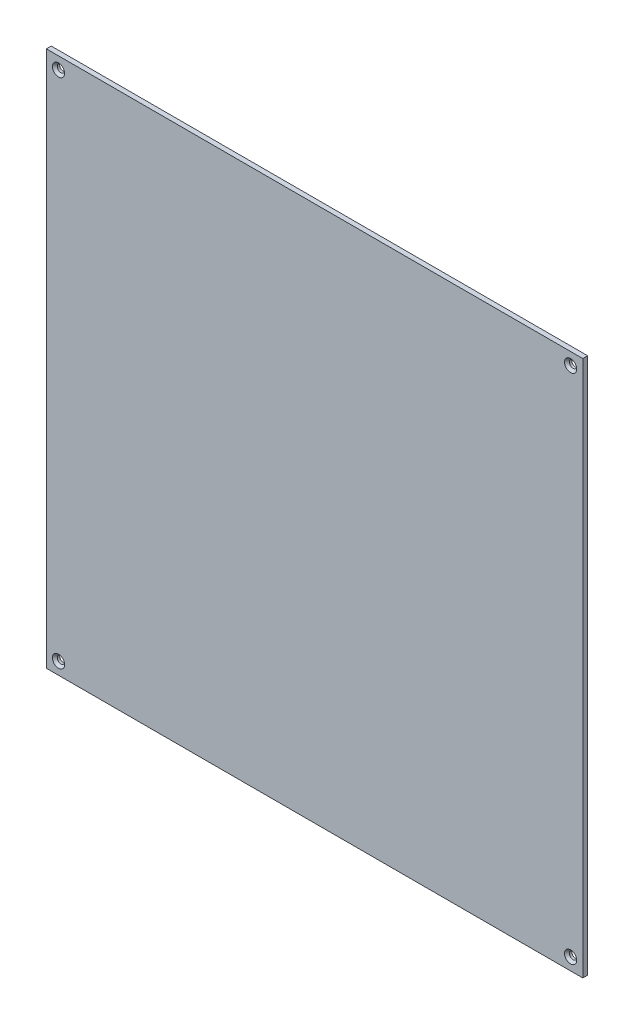
ISO-10303-21;
HEADER;
FILE_DESCRIPTION(('STEP AP214'),'2;1');
FILE_NAME('part.step','',(''),(''),'','','');
FILE_SCHEMA(('AUTOMOTIVE_DESIGN { 1 0 10303 214 1 1 1 1 }'));
ENDSEC;
DATA;
#1=APPLICATION_CONTEXT('core data for automotive mechanical design processes');
#2=APPLICATION_PROTOCOL_DEFINITION('international standard','automotive_design',2000,#1);
#3=PRODUCT_CONTEXT('',#1,'mechanical');
#4=PRODUCT('Part','Part','',(#3));
#5=PRODUCT_RELATED_PRODUCT_CATEGORY('part','',(#4));
#6=PRODUCT_DEFINITION_FORMATION('','',#4);
#7=PRODUCT_DEFINITION_CONTEXT('part definition',#1,'design');
#8=PRODUCT_DEFINITION('design','',#6,#7);
#9=PRODUCT_DEFINITION_SHAPE('','',#8);
#10=(LENGTH_UNIT() NAMED_UNIT(*) SI_UNIT(.MILLI.,.METRE.));
#11=(NAMED_UNIT(*) PLANE_ANGLE_UNIT() SI_UNIT($,.RADIAN.));
#12=(NAMED_UNIT(*) SI_UNIT($,.STERADIAN.) SOLID_ANGLE_UNIT());
#13=UNCERTAINTY_MEASURE_WITH_UNIT(LENGTH_MEASURE(1.E-05),#10,'distance_accuracy_value','');
#14=(GEOMETRIC_REPRESENTATION_CONTEXT(3) GLOBAL_UNCERTAINTY_ASSIGNED_CONTEXT((#13)) GLOBAL_UNIT_ASSIGNED_CONTEXT((#10,
#11,#12)) REPRESENTATION_CONTEXT('',''));
#15=CARTESIAN_POINT('',(0.,0.,0.));
#16=DIRECTION('',(0.,0.,1.));
#17=DIRECTION('',(1.,0.,0.));
#18=AXIS2_PLACEMENT_3D('',#15,#16,#17);
#19=CARTESIAN_POINT('',(0.,0.,2.));
#20=DIRECTION('',(0.,0.,1.));
#21=DIRECTION('',(1.,0.,0.));
#22=AXIS2_PLACEMENT_3D('',#19,#20,#21);
#23=PLANE('',#22);
#24=CARTESIAN_POINT('',(-105.,105.,2.));
#25=DIRECTION('',(0.,0.,1.));
#26=DIRECTION('',(1.,0.,0.));
#27=AXIS2_PLACEMENT_3D('',#24,#25,#26);
#28=CIRCLE('',#27,2.50000000000003);
#29=CARTESIAN_POINT('',(-102.5,105.,2.));
#30=VERTEX_POINT('',#29);
#31=EDGE_CURVE('E123',#30,#30,#28,.F.);
#32=ORIENTED_EDGE('',*,*,#31,.T.);
#33=EDGE_LOOP('',(#32));
#34=FACE_BOUND('',#33,.T.);
#35=CARTESIAN_POINT('',(105.,105.,2.));
#36=DIRECTION('',(0.,0.,1.));
#37=DIRECTION('',(1.,0.,0.));
#38=AXIS2_PLACEMENT_3D('',#35,#36,#37);
#39=CIRCLE('',#38,2.50000000000003);
#40=CARTESIAN_POINT('',(107.5,105.,2.));
#41=VERTEX_POINT('',#40);
#42=EDGE_CURVE('E120',#41,#41,#39,.F.);
#43=ORIENTED_EDGE('',*,*,#42,.T.);
#44=EDGE_LOOP('',(#43));
#45=FACE_BOUND('',#44,.T.);
#46=CARTESIAN_POINT('',(105.,-105.,2.));
#47=DIRECTION('',(0.,0.,1.));
#48=DIRECTION('',(1.,0.,0.));
#49=AXIS2_PLACEMENT_3D('',#46,#47,#48);
#50=CIRCLE('',#49,2.50000000000003);
#51=CARTESIAN_POINT('',(107.5,-105.,2.));
#52=VERTEX_POINT('',#51);
#53=EDGE_CURVE('E117',#52,#52,#50,.F.);
#54=ORIENTED_EDGE('',*,*,#53,.T.);
#55=EDGE_LOOP('',(#54));
#56=FACE_BOUND('',#55,.T.);
#57=CARTESIAN_POINT('',(-105.,-105.,2.));
#58=DIRECTION('',(0.,0.,1.));
#59=DIRECTION('',(1.,0.,0.));
#60=AXIS2_PLACEMENT_3D('',#57,#58,#59);
#61=CIRCLE('',#60,2.50000000000003);
#62=CARTESIAN_POINT('',(-102.5,-105.,2.));
#63=VERTEX_POINT('',#62);
#64=EDGE_CURVE('E114',#63,#63,#61,.F.);
#65=ORIENTED_EDGE('',*,*,#64,.T.);
#66=EDGE_LOOP('',(#65));
#67=FACE_BOUND('',#66,.T.);
#68=DIRECTION('',(0.,1.,0.));
#69=VECTOR('',#68,1.);
#70=CARTESIAN_POINT('',(110.,110.,2.));
#71=LINE('',#70,#69);
#72=CARTESIAN_POINT('',(110.,-110.,2.));
#73=VERTEX_POINT('',#72);
#74=CARTESIAN_POINT('',(110.,110.,2.));
#75=VERTEX_POINT('',#74);
#76=EDGE_CURVE('E86',#73,#75,#71,.T.);
#77=ORIENTED_EDGE('',*,*,#76,.T.);
#78=DIRECTION('',(-1.,0.,0.));
#79=VECTOR('',#78,1.);
#80=CARTESIAN_POINT('',(-110.,110.,2.));
#81=LINE('',#80,#79);
#82=CARTESIAN_POINT('',(-110.,110.,2.));
#83=VERTEX_POINT('',#82);
#84=EDGE_CURVE('E82',#75,#83,#81,.T.);
#85=ORIENTED_EDGE('',*,*,#84,.T.);
#86=DIRECTION('',(0.,-1.,0.));
#87=VECTOR('',#86,1.);
#88=CARTESIAN_POINT('',(-110.,110.,2.));
#89=LINE('',#88,#87);
#90=CARTESIAN_POINT('',(-110.,-110.,2.));
#91=VERTEX_POINT('',#90);
#92=EDGE_CURVE('E84',#83,#91,#89,.T.);
#93=ORIENTED_EDGE('',*,*,#92,.T.);
#94=DIRECTION('',(1.,0.,0.));
#95=VECTOR('',#94,1.);
#96=CARTESIAN_POINT('',(-110.,-110.,2.));
#97=LINE('',#96,#95);
#98=EDGE_CURVE('E51',#91,#73,#97,.T.);
#99=ORIENTED_EDGE('',*,*,#98,.T.);
#100=EDGE_LOOP('',(#77,#85,#93,#99));
#101=FACE_BOUND('',#100,.T.);
#102=ADVANCED_FACE('F34',(#34,#45,#56,#67,#101),#23,.T.);
#103=CARTESIAN_POINT('',(0.,0.,0.));
#104=DIRECTION('',(0.,0.,1.));
#105=DIRECTION('',(1.,0.,0.));
#106=AXIS2_PLACEMENT_3D('',#103,#104,#105);
#107=PLANE('',#106);
#108=CARTESIAN_POINT('',(105.,-105.,0.));
#109=DIRECTION('',(0.,0.,1.));
#110=DIRECTION('',(1.,0.,0.));
#111=AXIS2_PLACEMENT_3D('',#108,#109,#110);
#112=CIRCLE('',#111,1.5);
#113=CARTESIAN_POINT('',(106.5,-105.,0.));
#114=VERTEX_POINT('',#113);
#115=EDGE_CURVE('E193',#114,#114,#112,.T.);
#116=ORIENTED_EDGE('',*,*,#115,.T.);
#117=EDGE_LOOP('',(#116));
#118=FACE_BOUND('',#117,.T.);
#119=CARTESIAN_POINT('',(-105.,105.,0.));
#120=DIRECTION('',(0.,0.,1.));
#121=DIRECTION('',(1.,0.,0.));
#122=AXIS2_PLACEMENT_3D('',#119,#120,#121);
#123=CIRCLE('',#122,1.5);
#124=CARTESIAN_POINT('',(-103.5,105.,0.));
#125=VERTEX_POINT('',#124);
#126=EDGE_CURVE('E104',#125,#125,#123,.T.);
#127=ORIENTED_EDGE('',*,*,#126,.T.);
#128=EDGE_LOOP('',(#127));
#129=FACE_BOUND('',#128,.T.);
#130=DIRECTION('',(0.,1.,0.));
#131=VECTOR('',#130,1.);
#132=CARTESIAN_POINT('',(110.,110.,0.));
#133=LINE('',#132,#131);
#134=CARTESIAN_POINT('',(110.,-110.,0.));
#135=VERTEX_POINT('',#134);
#136=CARTESIAN_POINT('',(110.,110.,0.));
#137=VERTEX_POINT('',#136);
#138=EDGE_CURVE('E101',#135,#137,#133,.T.);
#139=ORIENTED_EDGE('',*,*,#138,.F.);
#140=DIRECTION('',(1.,0.,0.));
#141=VECTOR('',#140,1.);
#142=CARTESIAN_POINT('',(-110.,-110.,0.));
#143=LINE('',#142,#141);
#144=CARTESIAN_POINT('',(-110.,-110.,0.));
#145=VERTEX_POINT('',#144);
#146=EDGE_CURVE('E74',#145,#135,#143,.T.);
#147=ORIENTED_EDGE('',*,*,#146,.F.);
#148=DIRECTION('',(0.,-1.,0.));
#149=VECTOR('',#148,1.);
#150=CARTESIAN_POINT('',(-110.,110.,0.));
#151=LINE('',#150,#149);
#152=CARTESIAN_POINT('',(-110.,110.,0.));
#153=VERTEX_POINT('',#152);
#154=EDGE_CURVE('E68',#153,#145,#151,.T.);
#155=ORIENTED_EDGE('',*,*,#154,.F.);
#156=DIRECTION('',(-1.,0.,0.));
#157=VECTOR('',#156,1.);
#158=CARTESIAN_POINT('',(-110.,110.,0.));
#159=LINE('',#158,#157);
#160=EDGE_CURVE('E91',#137,#153,#159,.T.);
#161=ORIENTED_EDGE('',*,*,#160,.F.);
#162=EDGE_LOOP('',(#139,#147,#155,#161));
#163=FACE_BOUND('',#162,.T.);
#164=CARTESIAN_POINT('',(105.,105.,0.));
#165=DIRECTION('',(0.,0.,1.));
#166=DIRECTION('',(1.,0.,0.));
#167=AXIS2_PLACEMENT_3D('',#164,#165,#166);
#168=CIRCLE('',#167,1.5);
#169=CARTESIAN_POINT('',(106.5,105.,0.));
#170=VERTEX_POINT('',#169);
#171=EDGE_CURVE('E190',#170,#170,#168,.T.);
#172=ORIENTED_EDGE('',*,*,#171,.T.);
#173=EDGE_LOOP('',(#172));
#174=FACE_BOUND('',#173,.T.);
#175=CARTESIAN_POINT('',(-105.,-105.,0.));
#176=DIRECTION('',(0.,0.,1.));
#177=DIRECTION('',(1.,0.,0.));
#178=AXIS2_PLACEMENT_3D('',#175,#176,#177);
#179=CIRCLE('',#178,1.5);
#180=CARTESIAN_POINT('',(-103.5,-105.,0.));
#181=VERTEX_POINT('',#180);
#182=EDGE_CURVE('E198',#181,#181,#179,.T.);
#183=ORIENTED_EDGE('',*,*,#182,.T.);
#184=EDGE_LOOP('',(#183));
#185=FACE_BOUND('',#184,.T.);
#186=ADVANCED_FACE('F148',(#118,#129,#163,#174,#185),#107,.F.);
#187=CARTESIAN_POINT('',(110.,110.,2.));
#188=DIRECTION('',(-1.,0.,0.));
#189=DIRECTION('',(0.,-1.,0.));
#190=AXIS2_PLACEMENT_3D('',#187,#188,#189);
#191=PLANE('',#190);
#192=ORIENTED_EDGE('',*,*,#138,.T.);
#193=DIRECTION('',(0.,0.,-1.));
#194=VECTOR('',#193,1.);
#195=CARTESIAN_POINT('',(110.,110.,2.));
#196=LINE('',#195,#194);
#197=EDGE_CURVE('E92',#75,#137,#196,.T.);
#198=ORIENTED_EDGE('',*,*,#197,.F.);
#199=ORIENTED_EDGE('',*,*,#76,.F.);
#200=DIRECTION('',(0.,0.,-1.));
#201=VECTOR('',#200,1.);
#202=CARTESIAN_POINT('',(110.,-110.,2.));
#203=LINE('',#202,#201);
#204=EDGE_CURVE('E97',#73,#135,#203,.T.);
#205=ORIENTED_EDGE('',*,*,#204,.T.);
#206=EDGE_LOOP('',(#192,#198,#199,#205));
#207=FACE_BOUND('',#206,.T.);
#208=ADVANCED_FACE('F154',(#207),#191,.F.);
#209=CARTESIAN_POINT('',(-110.,110.,2.));
#210=DIRECTION('',(0.,-1.,0.));
#211=DIRECTION('',(0.,0.,-1.));
#212=AXIS2_PLACEMENT_3D('',#209,#210,#211);
#213=PLANE('',#212);
#214=ORIENTED_EDGE('',*,*,#160,.T.);
#215=DIRECTION('',(0.,0.,-1.));
#216=VECTOR('',#215,1.);
#217=CARTESIAN_POINT('',(-110.,110.,2.));
#218=LINE('',#217,#216);
#219=EDGE_CURVE('E89',#83,#153,#218,.T.);
#220=ORIENTED_EDGE('',*,*,#219,.F.);
#221=ORIENTED_EDGE('',*,*,#84,.F.);
#222=ORIENTED_EDGE('',*,*,#197,.T.);
#223=EDGE_LOOP('',(#214,#220,#221,#222));
#224=FACE_BOUND('',#223,.T.);
#225=ADVANCED_FACE('F90',(#224),#213,.F.);
#226=CARTESIAN_POINT('',(-110.,110.,2.));
#227=DIRECTION('',(1.,0.,0.));
#228=DIRECTION('',(0.,0.,-1.));
#229=AXIS2_PLACEMENT_3D('',#226,#227,#228);
#230=PLANE('',#229);
#231=ORIENTED_EDGE('',*,*,#154,.T.);
#232=DIRECTION('',(0.,0.,-1.));
#233=VECTOR('',#232,1.);
#234=CARTESIAN_POINT('',(-110.,-110.,2.));
#235=LINE('',#234,#233);
#236=EDGE_CURVE('E93',#91,#145,#235,.T.);
#237=ORIENTED_EDGE('',*,*,#236,.F.);
#238=ORIENTED_EDGE('',*,*,#92,.F.);
#239=ORIENTED_EDGE('',*,*,#219,.T.);
#240=EDGE_LOOP('',(#231,#237,#238,#239));
#241=FACE_BOUND('',#240,.T.);
#242=ADVANCED_FACE('F95',(#241),#230,.F.);
#243=CARTESIAN_POINT('',(-110.,-110.,2.));
#244=DIRECTION('',(0.,1.,0.));
#245=DIRECTION('',(0.,0.,1.));
#246=AXIS2_PLACEMENT_3D('',#243,#244,#245);
#247=PLANE('',#246);
#248=ORIENTED_EDGE('',*,*,#146,.T.);
#249=ORIENTED_EDGE('',*,*,#204,.F.);
#250=ORIENTED_EDGE('',*,*,#98,.F.);
#251=ORIENTED_EDGE('',*,*,#236,.T.);
#252=EDGE_LOOP('',(#248,#249,#250,#251));
#253=FACE_BOUND('',#252,.T.);
#254=ADVANCED_FACE('F162',(#253),#247,.F.);
#255=CARTESIAN_POINT('',(-105.,105.,2.));
#256=DIRECTION('',(0.,0.,-1.));
#257=DIRECTION('',(-1.,0.,0.));
#258=AXIS2_PLACEMENT_3D('',#255,#256,#257);
#259=CYLINDRICAL_SURFACE('',#258,1.5);
#260=CARTESIAN_POINT('',(-105.,105.,0.99999999999999));
#261=DIRECTION('',(0.,0.,1.));
#262=DIRECTION('',(1.,0.,0.));
#263=AXIS2_PLACEMENT_3D('',#260,#261,#262);
#264=CIRCLE('',#263,1.5);
#265=CARTESIAN_POINT('',(-103.5,105.,0.99999999999999));
#266=VERTEX_POINT('',#265);
#267=EDGE_CURVE('E111',#266,#266,#264,.T.);
#268=ORIENTED_EDGE('',*,*,#267,.T.);
#269=EDGE_LOOP('',(#268));
#270=FACE_BOUND('',#269,.T.);
#271=ORIENTED_EDGE('',*,*,#126,.F.);
#272=EDGE_LOOP('',(#271));
#273=FACE_BOUND('',#272,.T.);
#274=ADVANCED_FACE('F159',(#270,#273),#259,.F.);
#275=CARTESIAN_POINT('',(105.,105.,2.));
#276=DIRECTION('',(0.,0.,-1.));
#277=DIRECTION('',(-1.,0.,0.));
#278=AXIS2_PLACEMENT_3D('',#275,#276,#277);
#279=CYLINDRICAL_SURFACE('',#278,1.5);
#280=CARTESIAN_POINT('',(105.,105.,0.99999999999999));
#281=DIRECTION('',(0.,0.,1.));
#282=DIRECTION('',(1.,0.,0.));
#283=AXIS2_PLACEMENT_3D('',#280,#281,#282);
#284=CIRCLE('',#283,1.5);
#285=CARTESIAN_POINT('',(106.5,105.,0.99999999999999));
#286=VERTEX_POINT('',#285);
#287=EDGE_CURVE('E126',#286,#286,#284,.T.);
#288=ORIENTED_EDGE('',*,*,#287,.T.);
#289=EDGE_LOOP('',(#288));
#290=FACE_BOUND('',#289,.T.);
#291=ORIENTED_EDGE('',*,*,#171,.F.);
#292=EDGE_LOOP('',(#291));
#293=FACE_BOUND('',#292,.T.);
#294=ADVANCED_FACE('F186',(#290,#293),#279,.F.);
#295=CARTESIAN_POINT('',(105.,-105.,2.));
#296=DIRECTION('',(0.,0.,-1.));
#297=DIRECTION('',(-1.,0.,0.));
#298=AXIS2_PLACEMENT_3D('',#295,#296,#297);
#299=CYLINDRICAL_SURFACE('',#298,1.5);
#300=CARTESIAN_POINT('',(105.,-105.,0.99999999999999));
#301=DIRECTION('',(0.,0.,1.));
#302=DIRECTION('',(1.,0.,0.));
#303=AXIS2_PLACEMENT_3D('',#300,#301,#302);
#304=CIRCLE('',#303,1.5);
#305=CARTESIAN_POINT('',(106.5,-105.,0.99999999999999));
#306=VERTEX_POINT('',#305);
#307=EDGE_CURVE('E43',#306,#306,#304,.T.);
#308=ORIENTED_EDGE('',*,*,#307,.T.);
#309=EDGE_LOOP('',(#308));
#310=FACE_BOUND('',#309,.T.);
#311=ORIENTED_EDGE('',*,*,#115,.F.);
#312=EDGE_LOOP('',(#311));
#313=FACE_BOUND('',#312,.T.);
#314=ADVANCED_FACE('F131',(#310,#313),#299,.F.);
#315=CARTESIAN_POINT('',(-105.,-105.,2.));
#316=DIRECTION('',(0.,0.,-1.));
#317=DIRECTION('',(-1.,0.,0.));
#318=AXIS2_PLACEMENT_3D('',#315,#316,#317);
#319=CYLINDRICAL_SURFACE('',#318,1.5);
#320=CARTESIAN_POINT('',(-105.,-105.,0.99999999999999));
#321=DIRECTION('',(0.,0.,1.));
#322=DIRECTION('',(1.,0.,0.));
#323=AXIS2_PLACEMENT_3D('',#320,#321,#322);
#324=CIRCLE('',#323,1.5);
#325=CARTESIAN_POINT('',(-103.5,-105.,0.99999999999999));
#326=VERTEX_POINT('',#325);
#327=EDGE_CURVE('E11',#326,#326,#324,.T.);
#328=ORIENTED_EDGE('',*,*,#327,.T.);
#329=EDGE_LOOP('',(#328));
#330=FACE_BOUND('',#329,.T.);
#331=ORIENTED_EDGE('',*,*,#182,.F.);
#332=EDGE_LOOP('',(#331));
#333=FACE_BOUND('',#332,.T.);
#334=ADVANCED_FACE('F173',(#330,#333),#319,.F.);
#335=CARTESIAN_POINT('',(-105.,105.,0.99999999999999));
#336=DIRECTION('',(0.,0.,1.));
#337=DIRECTION('',(1.,0.,0.));
#338=AXIS2_PLACEMENT_3D('',#335,#336,#337);
#339=CONICAL_SURFACE('',#338,1.5,0.785398163397459);
#340=ORIENTED_EDGE('',*,*,#31,.F.);
#341=EDGE_LOOP('',(#340));
#342=FACE_BOUND('',#341,.T.);
#343=ORIENTED_EDGE('',*,*,#267,.F.);
#344=EDGE_LOOP('',(#343));
#345=FACE_BOUND('',#344,.T.);
#346=ADVANCED_FACE('F143',(#342,#345),#339,.F.);
#347=CARTESIAN_POINT('',(105.,105.,0.99999999999999));
#348=DIRECTION('',(0.,0.,1.));
#349=DIRECTION('',(1.,0.,0.));
#350=AXIS2_PLACEMENT_3D('',#347,#348,#349);
#351=CONICAL_SURFACE('',#350,1.5,0.785398163397459);
#352=ORIENTED_EDGE('',*,*,#42,.F.);
#353=EDGE_LOOP('',(#352));
#354=FACE_BOUND('',#353,.T.);
#355=ORIENTED_EDGE('',*,*,#287,.F.);
#356=EDGE_LOOP('',(#355));
#357=FACE_BOUND('',#356,.T.);
#358=ADVANCED_FACE('F136',(#354,#357),#351,.F.);
#359=CARTESIAN_POINT('',(105.,-105.,0.99999999999999));
#360=DIRECTION('',(0.,0.,1.));
#361=DIRECTION('',(1.,0.,0.));
#362=AXIS2_PLACEMENT_3D('',#359,#360,#361);
#363=CONICAL_SURFACE('',#362,1.5,0.785398163397459);
#364=ORIENTED_EDGE('',*,*,#53,.F.);
#365=EDGE_LOOP('',(#364));
#366=FACE_BOUND('',#365,.T.);
#367=ORIENTED_EDGE('',*,*,#307,.F.);
#368=EDGE_LOOP('',(#367));
#369=FACE_BOUND('',#368,.T.);
#370=ADVANCED_FACE('F134',(#366,#369),#363,.F.);
#371=CARTESIAN_POINT('',(-105.,-105.,0.99999999999999));
#372=DIRECTION('',(0.,0.,1.));
#373=DIRECTION('',(1.,0.,0.));
#374=AXIS2_PLACEMENT_3D('',#371,#372,#373);
#375=CONICAL_SURFACE('',#374,1.5,0.785398163397459);
#376=ORIENTED_EDGE('',*,*,#64,.F.);
#377=EDGE_LOOP('',(#376));
#378=FACE_BOUND('',#377,.T.);
#379=ORIENTED_EDGE('',*,*,#327,.F.);
#380=EDGE_LOOP('',(#379));
#381=FACE_BOUND('',#380,.T.);
#382=ADVANCED_FACE('F36',(#378,#381),#375,.F.);
#383=CLOSED_SHELL('',(#102,#186,#208,#225,#242,#254,#274,#294,#314,#334,#346,#358,#370,#382));
#384=MANIFOLD_SOLID_BREP('B2',#383);
#385=ADVANCED_BREP_SHAPE_REPRESENTATION('',(#18,#384),#14);
#386=SHAPE_DEFINITION_REPRESENTATION(#9,#385);
ENDSEC;
END-ISO-10303-21;
